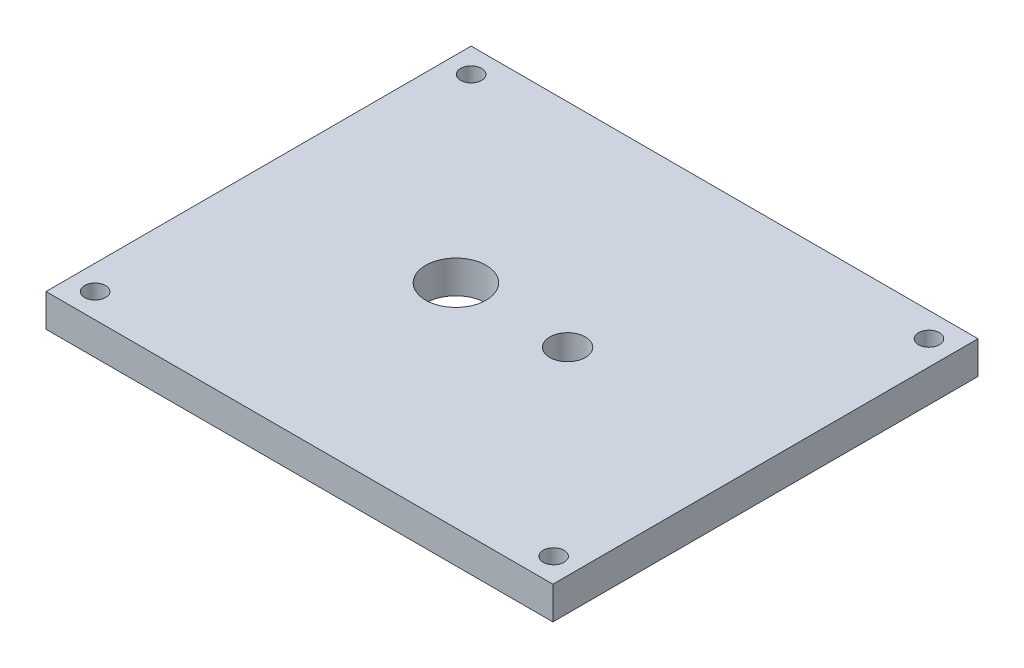
ISO-10303-21;
HEADER;
FILE_DESCRIPTION(('STEP AP214'),'2;1');
FILE_NAME('part.step','',(''),(''),'','','');
FILE_SCHEMA(('AUTOMOTIVE_DESIGN { 1 0 10303 214 1 1 1 1 }'));
ENDSEC;
DATA;
#1=APPLICATION_CONTEXT('core data for automotive mechanical design processes');
#2=APPLICATION_PROTOCOL_DEFINITION('international standard','automotive_design',2000,#1);
#3=PRODUCT_CONTEXT('',#1,'mechanical');
#4=PRODUCT('Part','Part','',(#3));
#5=PRODUCT_RELATED_PRODUCT_CATEGORY('part','',(#4));
#6=PRODUCT_DEFINITION_FORMATION('','',#4);
#7=PRODUCT_DEFINITION_CONTEXT('part definition',#1,'design');
#8=PRODUCT_DEFINITION('design','',#6,#7);
#9=PRODUCT_DEFINITION_SHAPE('','',#8);
#10=(LENGTH_UNIT() NAMED_UNIT(*) SI_UNIT(.MILLI.,.METRE.));
#11=(NAMED_UNIT(*) PLANE_ANGLE_UNIT() SI_UNIT($,.RADIAN.));
#12=(NAMED_UNIT(*) SI_UNIT($,.STERADIAN.) SOLID_ANGLE_UNIT());
#13=UNCERTAINTY_MEASURE_WITH_UNIT(LENGTH_MEASURE(1.E-05),#10,'distance_accuracy_value','');
#14=(GEOMETRIC_REPRESENTATION_CONTEXT(3) GLOBAL_UNCERTAINTY_ASSIGNED_CONTEXT((#13)) GLOBAL_UNIT_ASSIGNED_CONTEXT((#10,
#11,#12)) REPRESENTATION_CONTEXT('',''));
#15=CARTESIAN_POINT('',(0.,0.,0.));
#16=DIRECTION('',(0.,0.,1.));
#17=DIRECTION('',(1.,0.,0.));
#18=AXIS2_PLACEMENT_3D('',#15,#16,#17);
#19=CARTESIAN_POINT('',(39.37,5.08,33.02));
#20=DIRECTION('',(-1.,0.,0.));
#21=DIRECTION('',(0.,0.,1.));
#22=AXIS2_PLACEMENT_3D('',#19,#20,#21);
#23=PLANE('',#22);
#24=DIRECTION('',(0.,0.,-1.));
#25=VECTOR('',#24,1.);
#26=CARTESIAN_POINT('',(39.37,0.,33.02));
#27=LINE('',#26,#25);
#28=CARTESIAN_POINT('',(39.37,0.,33.02));
#29=VERTEX_POINT('',#28);
#30=CARTESIAN_POINT('',(39.37,0.,-33.02));
#31=VERTEX_POINT('',#30);
#32=EDGE_CURVE('E105',#29,#31,#27,.T.);
#33=ORIENTED_EDGE('',*,*,#32,.T.);
#34=DIRECTION('',(0.,-1.,0.));
#35=VECTOR('',#34,1.);
#36=CARTESIAN_POINT('',(39.37,5.08,-33.02));
#37=LINE('',#36,#35);
#38=CARTESIAN_POINT('',(39.37,5.08,-33.02));
#39=VERTEX_POINT('',#38);
#40=EDGE_CURVE('E11',#39,#31,#37,.T.);
#41=ORIENTED_EDGE('',*,*,#40,.F.);
#42=DIRECTION('',(0.,0.,-1.));
#43=VECTOR('',#42,1.);
#44=CARTESIAN_POINT('',(39.37,5.08,33.02));
#45=LINE('',#44,#43);
#46=CARTESIAN_POINT('',(39.37,5.08,33.02));
#47=VERTEX_POINT('',#46);
#48=EDGE_CURVE('E89',#47,#39,#45,.T.);
#49=ORIENTED_EDGE('',*,*,#48,.F.);
#50=DIRECTION('',(0.,-1.,0.));
#51=VECTOR('',#50,1.);
#52=CARTESIAN_POINT('',(39.37,5.08,33.02));
#53=LINE('',#52,#51);
#54=EDGE_CURVE('E98',#47,#29,#53,.T.);
#55=ORIENTED_EDGE('',*,*,#54,.T.);
#56=EDGE_LOOP('',(#33,#41,#49,#55));
#57=FACE_BOUND('',#56,.T.);
#58=ADVANCED_FACE('F39',(#57),#23,.F.);
#59=CARTESIAN_POINT('',(-39.37,5.08,-33.02));
#60=DIRECTION('',(0.,0.,1.));
#61=DIRECTION('',(1.,0.,0.));
#62=AXIS2_PLACEMENT_3D('',#59,#60,#61);
#63=PLANE('',#62);
#64=DIRECTION('',(-1.,0.,0.));
#65=VECTOR('',#64,1.);
#66=CARTESIAN_POINT('',(-39.37,0.,-33.02));
#67=LINE('',#66,#65);
#68=CARTESIAN_POINT('',(-39.37,0.,-33.02));
#69=VERTEX_POINT('',#68);
#70=EDGE_CURVE('E94',#31,#69,#67,.T.);
#71=ORIENTED_EDGE('',*,*,#70,.T.);
#72=DIRECTION('',(0.,-1.,0.));
#73=VECTOR('',#72,1.);
#74=CARTESIAN_POINT('',(-39.37,5.08,-33.02));
#75=LINE('',#74,#73);
#76=CARTESIAN_POINT('',(-39.37,5.08,-33.02));
#77=VERTEX_POINT('',#76);
#78=EDGE_CURVE('E50',#77,#69,#75,.T.);
#79=ORIENTED_EDGE('',*,*,#78,.F.);
#80=DIRECTION('',(-1.,0.,0.));
#81=VECTOR('',#80,1.);
#82=CARTESIAN_POINT('',(-39.37,5.08,-33.02));
#83=LINE('',#82,#81);
#84=EDGE_CURVE('E81',#39,#77,#83,.T.);
#85=ORIENTED_EDGE('',*,*,#84,.F.);
#86=ORIENTED_EDGE('',*,*,#40,.T.);
#87=EDGE_LOOP('',(#71,#79,#85,#86));
#88=FACE_BOUND('',#87,.T.);
#89=ADVANCED_FACE('F91',(#88),#63,.F.);
#90=CARTESIAN_POINT('',(-39.37,5.08,33.02));
#91=DIRECTION('',(1.,0.,0.));
#92=DIRECTION('',(0.,0.,-1.));
#93=AXIS2_PLACEMENT_3D('',#90,#91,#92);
#94=PLANE('',#93);
#95=DIRECTION('',(0.,0.,1.));
#96=VECTOR('',#95,1.);
#97=CARTESIAN_POINT('',(-39.37,0.,33.02));
#98=LINE('',#97,#96);
#99=CARTESIAN_POINT('',(-39.37,0.,33.02));
#100=VERTEX_POINT('',#99);
#101=EDGE_CURVE('E75',#69,#100,#98,.T.);
#102=ORIENTED_EDGE('',*,*,#101,.T.);
#103=DIRECTION('',(0.,-1.,0.));
#104=VECTOR('',#103,1.);
#105=CARTESIAN_POINT('',(-39.37,5.08,33.02));
#106=LINE('',#105,#104);
#107=CARTESIAN_POINT('',(-39.37,5.08,33.02));
#108=VERTEX_POINT('',#107);
#109=EDGE_CURVE('E92',#108,#100,#106,.T.);
#110=ORIENTED_EDGE('',*,*,#109,.F.);
#111=DIRECTION('',(0.,0.,1.));
#112=VECTOR('',#111,1.);
#113=CARTESIAN_POINT('',(-39.37,5.08,33.02));
#114=LINE('',#113,#112);
#115=EDGE_CURVE('E86',#77,#108,#114,.T.);
#116=ORIENTED_EDGE('',*,*,#115,.F.);
#117=ORIENTED_EDGE('',*,*,#78,.T.);
#118=EDGE_LOOP('',(#102,#110,#116,#117));
#119=FACE_BOUND('',#118,.T.);
#120=ADVANCED_FACE('F96',(#119),#94,.F.);
#121=CARTESIAN_POINT('',(-39.37,5.08,33.02));
#122=DIRECTION('',(0.,0.,-1.));
#123=DIRECTION('',(-1.,0.,0.));
#124=AXIS2_PLACEMENT_3D('',#121,#122,#123);
#125=PLANE('',#124);
#126=DIRECTION('',(1.,0.,0.));
#127=VECTOR('',#126,1.);
#128=CARTESIAN_POINT('',(-39.37,0.,33.02));
#129=LINE('',#128,#127);
#130=EDGE_CURVE('E79',#100,#29,#129,.T.);
#131=ORIENTED_EDGE('',*,*,#130,.T.);
#132=ORIENTED_EDGE('',*,*,#54,.F.);
#133=DIRECTION('',(1.,0.,0.));
#134=VECTOR('',#133,1.);
#135=CARTESIAN_POINT('',(-39.37,5.08,33.02));
#136=LINE('',#135,#134);
#137=EDGE_CURVE('E54',#108,#47,#136,.T.);
#138=ORIENTED_EDGE('',*,*,#137,.F.);
#139=ORIENTED_EDGE('',*,*,#109,.T.);
#140=EDGE_LOOP('',(#131,#132,#138,#139));
#141=FACE_BOUND('',#140,.T.);
#142=ADVANCED_FACE('F109',(#141),#125,.F.);
#143=CARTESIAN_POINT('',(0.,5.08,0.));
#144=DIRECTION('',(0.,-1.,0.));
#145=DIRECTION('',(0.,0.,-1.));
#146=AXIS2_PLACEMENT_3D('',#143,#144,#145);
#147=PLANE('',#146);
#148=CARTESIAN_POINT('',(-35.56,5.08,-29.21));
#149=DIRECTION('',(0.,1.,0.));
#150=DIRECTION('',(0.,0.,1.));
#151=AXIS2_PLACEMENT_3D('',#148,#149,#150);
#152=CIRCLE('',#151,1.62559999999999);
#153=CARTESIAN_POINT('',(-35.56,5.08,-27.5844));
#154=VERTEX_POINT('',#153);
#155=EDGE_CURVE('E146',#154,#154,#152,.T.);
#156=ORIENTED_EDGE('',*,*,#155,.F.);
#157=EDGE_LOOP('',(#156));
#158=FACE_BOUND('',#157,.T.);
#159=CARTESIAN_POINT('',(-35.56,5.08,29.21));
#160=DIRECTION('',(0.,1.,0.));
#161=DIRECTION('',(0.,0.,1.));
#162=AXIS2_PLACEMENT_3D('',#159,#160,#161);
#163=CIRCLE('',#162,1.62559999999998);
#164=CARTESIAN_POINT('',(-35.56,5.08,30.8356));
#165=VERTEX_POINT('',#164);
#166=EDGE_CURVE('E142',#165,#165,#163,.T.);
#167=ORIENTED_EDGE('',*,*,#166,.F.);
#168=EDGE_LOOP('',(#167));
#169=FACE_BOUND('',#168,.T.);
#170=CARTESIAN_POINT('',(35.676601494,5.08,29.21));
#171=DIRECTION('',(0.,1.,0.));
#172=DIRECTION('',(0.,0.,1.));
#173=AXIS2_PLACEMENT_3D('',#170,#171,#172);
#174=CIRCLE('',#173,1.62559999999998);
#175=CARTESIAN_POINT('',(35.676601494,5.08,30.8356));
#176=VERTEX_POINT('',#175);
#177=EDGE_CURVE('E137',#176,#176,#174,.T.);
#178=ORIENTED_EDGE('',*,*,#177,.F.);
#179=EDGE_LOOP('',(#178));
#180=FACE_BOUND('',#179,.T.);
#181=CARTESIAN_POINT('',(35.56,5.08,-29.21));
#182=DIRECTION('',(0.,1.,0.));
#183=DIRECTION('',(0.,0.,1.));
#184=AXIS2_PLACEMENT_3D('',#181,#182,#183);
#185=CIRCLE('',#184,1.62559999999998);
#186=CARTESIAN_POINT('',(35.56,5.08,-27.5844));
#187=VERTEX_POINT('',#186);
#188=EDGE_CURVE('E128',#187,#187,#185,.T.);
#189=ORIENTED_EDGE('',*,*,#188,.F.);
#190=EDGE_LOOP('',(#189));
#191=FACE_BOUND('',#190,.T.);
#192=CARTESIAN_POINT('',(-8.7122,5.08,0.));
#193=DIRECTION('',(0.,1.,0.));
#194=DIRECTION('',(0.,0.,1.));
#195=AXIS2_PLACEMENT_3D('',#192,#193,#194);
#196=CIRCLE('',#195,4.699);
#197=CARTESIAN_POINT('',(-8.7122,5.08,4.699));
#198=VERTEX_POINT('',#197);
#199=EDGE_CURVE('E123',#198,#198,#196,.T.);
#200=ORIENTED_EDGE('',*,*,#199,.F.);
#201=EDGE_LOOP('',(#200));
#202=FACE_BOUND('',#201,.T.);
#203=CARTESIAN_POINT('',(8.636,5.08,0.));
#204=DIRECTION('',(0.,1.,0.));
#205=DIRECTION('',(0.,0.,1.));
#206=AXIS2_PLACEMENT_3D('',#203,#204,#205);
#207=CIRCLE('',#206,2.7686);
#208=CARTESIAN_POINT('',(8.636,5.08,2.7686));
#209=VERTEX_POINT('',#208);
#210=EDGE_CURVE('E116',#209,#209,#207,.T.);
#211=ORIENTED_EDGE('',*,*,#210,.F.);
#212=EDGE_LOOP('',(#211));
#213=FACE_BOUND('',#212,.T.);
#214=ORIENTED_EDGE('',*,*,#48,.T.);
#215=ORIENTED_EDGE('',*,*,#84,.T.);
#216=ORIENTED_EDGE('',*,*,#115,.T.);
#217=ORIENTED_EDGE('',*,*,#137,.T.);
#218=EDGE_LOOP('',(#214,#215,#216,#217));
#219=FACE_BOUND('',#218,.T.);
#220=ADVANCED_FACE('F88',(#158,#169,#180,#191,#202,#213,#219),#147,.F.);
#221=CARTESIAN_POINT('',(0.,0.,0.));
#222=DIRECTION('',(0.,-1.,0.));
#223=DIRECTION('',(0.,0.,-1.));
#224=AXIS2_PLACEMENT_3D('',#221,#222,#223);
#225=PLANE('',#224);
#226=CARTESIAN_POINT('',(-35.56,0.,-29.21));
#227=DIRECTION('',(0.,1.,0.));
#228=DIRECTION('',(0.,0.,1.));
#229=AXIS2_PLACEMENT_3D('',#226,#227,#228);
#230=CIRCLE('',#229,1.6256);
#231=CARTESIAN_POINT('',(-35.56,0.,-27.5844));
#232=VERTEX_POINT('',#231);
#233=EDGE_CURVE('E144',#232,#232,#230,.T.);
#234=ORIENTED_EDGE('',*,*,#233,.T.);
#235=EDGE_LOOP('',(#234));
#236=FACE_BOUND('',#235,.T.);
#237=CARTESIAN_POINT('',(-35.56,0.,29.21));
#238=DIRECTION('',(0.,1.,0.));
#239=DIRECTION('',(0.,0.,1.));
#240=AXIS2_PLACEMENT_3D('',#237,#238,#239);
#241=CIRCLE('',#240,1.6256);
#242=CARTESIAN_POINT('',(-35.56,0.,30.8356));
#243=VERTEX_POINT('',#242);
#244=EDGE_CURVE('E139',#243,#243,#241,.T.);
#245=ORIENTED_EDGE('',*,*,#244,.T.);
#246=EDGE_LOOP('',(#245));
#247=FACE_BOUND('',#246,.T.);
#248=CARTESIAN_POINT('',(35.676601494,0.,29.21));
#249=DIRECTION('',(0.,1.,0.));
#250=DIRECTION('',(0.,0.,1.));
#251=AXIS2_PLACEMENT_3D('',#248,#249,#250);
#252=CIRCLE('',#251,1.6256);
#253=CARTESIAN_POINT('',(35.676601494,0.,30.8356));
#254=VERTEX_POINT('',#253);
#255=EDGE_CURVE('E134',#254,#254,#252,.T.);
#256=ORIENTED_EDGE('',*,*,#255,.T.);
#257=EDGE_LOOP('',(#256));
#258=FACE_BOUND('',#257,.T.);
#259=CARTESIAN_POINT('',(35.56,0.,-29.21));
#260=DIRECTION('',(0.,1.,0.));
#261=DIRECTION('',(0.,0.,1.));
#262=AXIS2_PLACEMENT_3D('',#259,#260,#261);
#263=CIRCLE('',#262,1.6256);
#264=CARTESIAN_POINT('',(35.56,0.,-27.5844));
#265=VERTEX_POINT('',#264);
#266=EDGE_CURVE('E118',#265,#265,#263,.T.);
#267=ORIENTED_EDGE('',*,*,#266,.T.);
#268=EDGE_LOOP('',(#267));
#269=FACE_BOUND('',#268,.T.);
#270=CARTESIAN_POINT('',(-8.7122,0.,0.));
#271=DIRECTION('',(0.,1.,0.));
#272=DIRECTION('',(0.,0.,1.));
#273=AXIS2_PLACEMENT_3D('',#270,#271,#272);
#274=CIRCLE('',#273,4.699);
#275=CARTESIAN_POINT('',(-8.7122,0.,4.699));
#276=VERTEX_POINT('',#275);
#277=EDGE_CURVE('E104',#276,#276,#274,.T.);
#278=ORIENTED_EDGE('',*,*,#277,.T.);
#279=EDGE_LOOP('',(#278));
#280=FACE_BOUND('',#279,.T.);
#281=CARTESIAN_POINT('',(8.636,0.,0.));
#282=DIRECTION('',(0.,1.,0.));
#283=DIRECTION('',(0.,0.,1.));
#284=AXIS2_PLACEMENT_3D('',#281,#282,#283);
#285=CIRCLE('',#284,2.7686);
#286=CARTESIAN_POINT('',(8.636,0.,2.7686));
#287=VERTEX_POINT('',#286);
#288=EDGE_CURVE('E117',#287,#287,#285,.T.);
#289=ORIENTED_EDGE('',*,*,#288,.T.);
#290=EDGE_LOOP('',(#289));
#291=FACE_BOUND('',#290,.T.);
#292=ORIENTED_EDGE('',*,*,#32,.F.);
#293=ORIENTED_EDGE('',*,*,#130,.F.);
#294=ORIENTED_EDGE('',*,*,#101,.F.);
#295=ORIENTED_EDGE('',*,*,#70,.F.);
#296=EDGE_LOOP('',(#292,#293,#294,#295));
#297=FACE_BOUND('',#296,.T.);
#298=ADVANCED_FACE('F114',(#236,#247,#258,#269,#280,#291,#297),#225,.T.);
#299=CARTESIAN_POINT('',(8.636,0.,0.));
#300=DIRECTION('',(0.,1.,0.));
#301=DIRECTION('',(0.,0.,1.));
#302=AXIS2_PLACEMENT_3D('',#299,#300,#301);
#303=CYLINDRICAL_SURFACE('',#302,2.7686);
#304=ORIENTED_EDGE('',*,*,#288,.F.);
#305=EDGE_LOOP('',(#304));
#306=FACE_BOUND('',#305,.T.);
#307=ORIENTED_EDGE('',*,*,#210,.T.);
#308=EDGE_LOOP('',(#307));
#309=FACE_BOUND('',#308,.T.);
#310=ADVANCED_FACE('F170',(#306,#309),#303,.F.);
#311=CARTESIAN_POINT('',(-8.7122,0.,0.));
#312=DIRECTION('',(0.,1.,0.));
#313=DIRECTION('',(0.,0.,1.));
#314=AXIS2_PLACEMENT_3D('',#311,#312,#313);
#315=CYLINDRICAL_SURFACE('',#314,4.699);
#316=ORIENTED_EDGE('',*,*,#277,.F.);
#317=EDGE_LOOP('',(#316));
#318=FACE_BOUND('',#317,.T.);
#319=ORIENTED_EDGE('',*,*,#199,.T.);
#320=EDGE_LOOP('',(#319));
#321=FACE_BOUND('',#320,.T.);
#322=ADVANCED_FACE('F166',(#318,#321),#315,.F.);
#323=CARTESIAN_POINT('',(35.56,5.08,-29.21));
#324=DIRECTION('',(0.,1.,0.));
#325=DIRECTION('',(0.,0.,1.));
#326=AXIS2_PLACEMENT_3D('',#323,#324,#325);
#327=CYLINDRICAL_SURFACE('',#326,1.62559999999999);
#328=ORIENTED_EDGE('',*,*,#266,.F.);
#329=EDGE_LOOP('',(#328));
#330=FACE_BOUND('',#329,.T.);
#331=ORIENTED_EDGE('',*,*,#188,.T.);
#332=EDGE_LOOP('',(#331));
#333=FACE_BOUND('',#332,.T.);
#334=ADVANCED_FACE('F177',(#330,#333),#327,.F.);
#335=CARTESIAN_POINT('',(35.676601494,5.08,29.21));
#336=DIRECTION('',(0.,1.,0.));
#337=DIRECTION('',(0.,0.,1.));
#338=AXIS2_PLACEMENT_3D('',#335,#336,#337);
#339=CYLINDRICAL_SURFACE('',#338,1.62559999999999);
#340=ORIENTED_EDGE('',*,*,#255,.F.);
#341=EDGE_LOOP('',(#340));
#342=FACE_BOUND('',#341,.T.);
#343=ORIENTED_EDGE('',*,*,#177,.T.);
#344=EDGE_LOOP('',(#343));
#345=FACE_BOUND('',#344,.T.);
#346=ADVANCED_FACE('F237',(#342,#345),#339,.F.);
#347=CARTESIAN_POINT('',(-35.56,5.08,29.21));
#348=DIRECTION('',(0.,1.,0.));
#349=DIRECTION('',(0.,0.,1.));
#350=AXIS2_PLACEMENT_3D('',#347,#348,#349);
#351=CYLINDRICAL_SURFACE('',#350,1.62559999999999);
#352=ORIENTED_EDGE('',*,*,#244,.F.);
#353=EDGE_LOOP('',(#352));
#354=FACE_BOUND('',#353,.T.);
#355=ORIENTED_EDGE('',*,*,#166,.T.);
#356=EDGE_LOOP('',(#355));
#357=FACE_BOUND('',#356,.T.);
#358=ADVANCED_FACE('F243',(#354,#357),#351,.F.);
#359=CARTESIAN_POINT('',(-35.56,5.08,-29.21));
#360=DIRECTION('',(0.,1.,0.));
#361=DIRECTION('',(0.,0.,1.));
#362=AXIS2_PLACEMENT_3D('',#359,#360,#361);
#363=CYLINDRICAL_SURFACE('',#362,1.62559999999999);
#364=ORIENTED_EDGE('',*,*,#233,.F.);
#365=EDGE_LOOP('',(#364));
#366=FACE_BOUND('',#365,.T.);
#367=ORIENTED_EDGE('',*,*,#155,.T.);
#368=EDGE_LOOP('',(#367));
#369=FACE_BOUND('',#368,.T.);
#370=ADVANCED_FACE('F155',(#366,#369),#363,.F.);
#371=CLOSED_SHELL('',(#58,#89,#120,#142,#220,#298,#310,#322,#334,#346,#358,#370));
#372=MANIFOLD_SOLID_BREP('B2',#371);
#373=ADVANCED_BREP_SHAPE_REPRESENTATION('',(#18,#372),#14);
#374=SHAPE_DEFINITION_REPRESENTATION(#9,#373);
ENDSEC;
END-ISO-10303-21;
